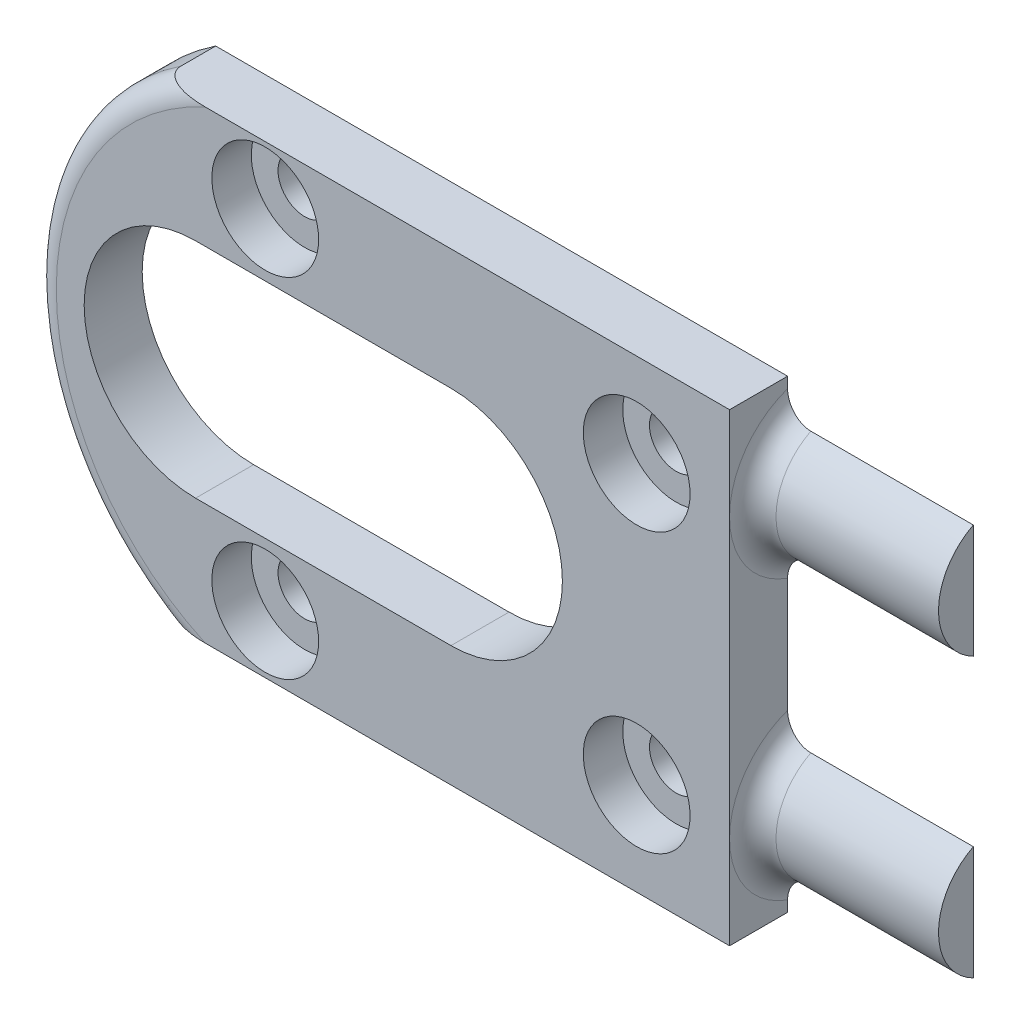
ISO-10303-21;
HEADER;
FILE_DESCRIPTION(('STEP AP214'),'2;1');
FILE_NAME('part.step','',(''),(''),'','','');
FILE_SCHEMA(('AUTOMOTIVE_DESIGN { 1 0 10303 214 1 1 1 1 }'));
ENDSEC;
DATA;
#1=APPLICATION_CONTEXT('core data for automotive mechanical design processes');
#2=APPLICATION_PROTOCOL_DEFINITION('international standard','automotive_design',2000,#1);
#3=PRODUCT_CONTEXT('',#1,'mechanical');
#4=PRODUCT('Part','Part','',(#3));
#5=PRODUCT_RELATED_PRODUCT_CATEGORY('part','',(#4));
#6=PRODUCT_DEFINITION_FORMATION('','',#4);
#7=PRODUCT_DEFINITION_CONTEXT('part definition',#1,'design');
#8=PRODUCT_DEFINITION('design','',#6,#7);
#9=PRODUCT_DEFINITION_SHAPE('','',#8);
#10=(LENGTH_UNIT() NAMED_UNIT(*) SI_UNIT(.MILLI.,.METRE.));
#11=(NAMED_UNIT(*) PLANE_ANGLE_UNIT() SI_UNIT($,.RADIAN.));
#12=(NAMED_UNIT(*) SI_UNIT($,.STERADIAN.) SOLID_ANGLE_UNIT());
#13=UNCERTAINTY_MEASURE_WITH_UNIT(LENGTH_MEASURE(1.E-05),#10,'distance_accuracy_value','');
#14=(GEOMETRIC_REPRESENTATION_CONTEXT(3) GLOBAL_UNCERTAINTY_ASSIGNED_CONTEXT((#13)) GLOBAL_UNIT_ASSIGNED_CONTEXT((#10,
#11,#12)) REPRESENTATION_CONTEXT('',''));
#15=CARTESIAN_POINT('',(0.,0.,0.));
#16=DIRECTION('',(0.,0.,1.));
#17=DIRECTION('',(1.,0.,0.));
#18=AXIS2_PLACEMENT_3D('',#15,#16,#17);
#19=CARTESIAN_POINT('',(15.,-10.,2.5));
#20=DIRECTION('',(-1.,0.,0.));
#21=DIRECTION('',(0.,0.,1.));
#22=AXIS2_PLACEMENT_3D('',#19,#20,#21);
#23=PLANE('',#22);
#24=DIRECTION('',(0.,1.,0.));
#25=VECTOR('',#24,1.);
#26=CARTESIAN_POINT('',(15.,-10.,0.));
#27=LINE('',#26,#25);
#28=CARTESIAN_POINT('',(15.,-2.46446609406726,0.));
#29=VERTEX_POINT('',#28);
#30=CARTESIAN_POINT('',(15.,2.46446609406726,0.));
#31=VERTEX_POINT('',#30);
#32=EDGE_CURVE('E232',#29,#31,#27,.T.);
#33=ORIENTED_EDGE('',*,*,#32,.T.);
#34=CARTESIAN_POINT('',(15.,6.,-1.25));
#35=DIRECTION('',(-1.,0.,0.));
#36=DIRECTION('',(0.,0.,1.));
#37=AXIS2_PLACEMENT_3D('',#34,#35,#36);
#38=CIRCLE('',#37,3.75);
#39=CARTESIAN_POINT('',(15.,6.,2.5));
#40=VERTEX_POINT('',#39);
#41=EDGE_CURVE('E258',#31,#40,#38,.T.);
#42=ORIENTED_EDGE('',*,*,#41,.T.);
#43=DIRECTION('',(0.,1.,0.));
#44=VECTOR('',#43,1.);
#45=CARTESIAN_POINT('',(15.,-10.,2.5));
#46=LINE('',#45,#44);
#47=CARTESIAN_POINT('',(15.,-6.,2.5));
#48=VERTEX_POINT('',#47);
#49=EDGE_CURVE('E221',#48,#40,#46,.T.);
#50=ORIENTED_EDGE('',*,*,#49,.F.);
#51=CARTESIAN_POINT('',(15.,-6.,-1.25));
#52=DIRECTION('',(-1.,0.,0.));
#53=DIRECTION('',(0.,0.,1.));
#54=AXIS2_PLACEMENT_3D('',#51,#52,#53);
#55=CIRCLE('',#54,3.75);
#56=EDGE_CURVE('E252',#48,#29,#55,.T.);
#57=ORIENTED_EDGE('',*,*,#56,.T.);
#58=EDGE_LOOP('',(#33,#42,#50,#57));
#59=FACE_BOUND('',#58,.T.);
#60=ADVANCED_FACE('F34',(#59),#23,.F.);
#61=CARTESIAN_POINT('',(15.,-10.,0.));
#62=VERTEX_POINT('',#61);
#63=CARTESIAN_POINT('',(15.,-9.53553390593274,0.));
#64=VERTEX_POINT('',#63);
#65=EDGE_CURVE('E228',#62,#64,#27,.T.);
#66=ORIENTED_EDGE('',*,*,#65,.T.);
#67=CARTESIAN_POINT('',(15.,-6.,-1.25));
#68=DIRECTION('',(-1.,0.,0.));
#69=DIRECTION('',(0.,0.,1.));
#70=AXIS2_PLACEMENT_3D('',#67,#68,#69);
#71=CIRCLE('',#70,3.75);
#72=EDGE_CURVE('E254',#64,#48,#71,.T.);
#73=ORIENTED_EDGE('',*,*,#72,.T.);
#74=CARTESIAN_POINT('',(15.,-10.,2.5));
#75=VERTEX_POINT('',#74);
#76=EDGE_CURVE('E217',#75,#48,#46,.T.);
#77=ORIENTED_EDGE('',*,*,#76,.F.);
#78=DIRECTION('',(0.,0.,-1.));
#79=VECTOR('',#78,1.);
#80=CARTESIAN_POINT('',(15.,-10.,2.5));
#81=LINE('',#80,#79);
#82=EDGE_CURVE('E227',#75,#62,#81,.T.);
#83=ORIENTED_EDGE('',*,*,#82,.T.);
#84=EDGE_LOOP('',(#66,#73,#77,#83));
#85=FACE_BOUND('',#84,.T.);
#86=ADVANCED_FACE('F319',(#85),#23,.F.);
#87=CARTESIAN_POINT('',(15.,10.,2.5));
#88=VERTEX_POINT('',#87);
#89=EDGE_CURVE('E222',#40,#88,#46,.T.);
#90=ORIENTED_EDGE('',*,*,#89,.F.);
#91=CARTESIAN_POINT('',(15.,6.,-1.25));
#92=DIRECTION('',(-1.,0.,0.));
#93=DIRECTION('',(0.,0.,1.));
#94=AXIS2_PLACEMENT_3D('',#91,#92,#93);
#95=CIRCLE('',#94,3.75);
#96=CARTESIAN_POINT('',(15.,9.53553390593274,0.));
#97=VERTEX_POINT('',#96);
#98=EDGE_CURVE('E256',#40,#97,#95,.T.);
#99=ORIENTED_EDGE('',*,*,#98,.T.);
#100=CARTESIAN_POINT('',(15.,10.,0.));
#101=VERTEX_POINT('',#100);
#102=EDGE_CURVE('E216',#97,#101,#27,.T.);
#103=ORIENTED_EDGE('',*,*,#102,.T.);
#104=DIRECTION('',(0.,0.,-1.));
#105=VECTOR('',#104,1.);
#106=CARTESIAN_POINT('',(15.,10.,2.5));
#107=LINE('',#106,#105);
#108=EDGE_CURVE('E246',#88,#101,#107,.T.);
#109=ORIENTED_EDGE('',*,*,#108,.F.);
#110=EDGE_LOOP('',(#90,#99,#103,#109));
#111=FACE_BOUND('',#110,.T.);
#112=ADVANCED_FACE('F321',(#111),#23,.F.);
#113=CARTESIAN_POINT('',(15.,10.,2.5));
#114=DIRECTION('',(0.,-1.,0.));
#115=DIRECTION('',(0.,0.,-1.));
#116=AXIS2_PLACEMENT_3D('',#113,#114,#115);
#117=PLANE('',#116);
#118=DIRECTION('',(0.,0.,-1.));
#119=VECTOR('',#118,1.);
#120=CARTESIAN_POINT('',(-9.6332495807108,10.,2.5));
#121=LINE('',#120,#119);
#122=CARTESIAN_POINT('',(-9.6332495807108,10.,1.5));
#123=VERTEX_POINT('',#122);
#124=CARTESIAN_POINT('',(-9.6332495807108,10.,0.));
#125=VERTEX_POINT('',#124);
#126=EDGE_CURVE('E244',#123,#125,#121,.T.);
#127=ORIENTED_EDGE('',*,*,#126,.F.);
#128=CARTESIAN_POINT('',(-9.6332495807108,10.,1.5));
#129=CARTESIAN_POINT('',(-9.63325639971954,10.,1.51954510592595));
#130=CARTESIAN_POINT('',(-9.63221194825764,10.,1.53907476119535));
#131=CARTESIAN_POINT('',(-9.62809335238027,10.,1.57789193424015));
#132=CARTESIAN_POINT('',(-9.62502206718861,10.,1.59717975416807));
#133=CARTESIAN_POINT('',(-9.61298437011207,10.,1.65391936406916));
#134=CARTESIAN_POINT('',(-9.60118962271173,10.,1.69079700629704));
#135=CARTESIAN_POINT('',(-9.57130716185599,10.,1.76158317660842));
#136=CARTESIAN_POINT('',(-9.55325263359245,10.,1.79550620445922));
#137=CARTESIAN_POINT('',(-9.51215006270882,10.,1.86028616570347));
#138=CARTESIAN_POINT('',(-9.48908452007075,10.,1.89113178655636));
#139=CARTESIAN_POINT('',(-9.42514252616316,10.,1.96606714160381));
#140=CARTESIAN_POINT('',(-9.38155311062992,10.,2.00782695554724));
#141=CARTESIAN_POINT('',(-9.28857219436247,10.,2.08419107862147));
#142=CARTESIAN_POINT('',(-9.23916999992083,10.,2.11878186580884));
#143=CARTESIAN_POINT('',(-9.1434038771087,10.,2.17764542431777));
#144=CARTESIAN_POINT('',(-9.09749761208398,10.,2.2026772167823));
#145=CARTESIAN_POINT('',(-9.00369260015971,10.,2.24871518651012));
#146=CARTESIAN_POINT('',(-8.95579232438649,10.,2.26971820292006));
#147=CARTESIAN_POINT('',(-8.80954290181428,10.,2.32766201903829));
#148=CARTESIAN_POINT('',(-8.70908197643146,10.,2.35928709620501));
#149=CARTESIAN_POINT('',(-8.52284097338611,10.,2.40709000028991));
#150=CARTESIAN_POINT('',(-8.43746874240701,10.,2.42497996010652));
#151=CARTESIAN_POINT('',(-8.26555472462409,10.,2.4544932933987));
#152=CARTESIAN_POINT('',(-8.17901173634607,10.,2.46610963447681));
#153=CARTESIAN_POINT('',(-8.00746557544746,10.,2.48382561877007));
#154=CARTESIAN_POINT('',(-7.92247455061853,10.,2.49004954317488));
#155=CARTESIAN_POINT('',(-7.75250279299976,10.,2.49811856095696));
#156=CARTESIAN_POINT('',(-7.66752261983414,10.,2.49997511584017));
#157=CARTESIAN_POINT('',(-7.58257569495583,10.,2.5));
#158=B_SPLINE_CURVE_WITH_KNOTS('',3,(#128,#129,#130,#131,#132,#133,#134,#135,#136,#137,#138,
#139,#140,#141,#142,#143,#144,#145,#146,#147,#148,#149,#150,#151,#152,#153,#154,#155,#156,#157),
.UNSPECIFIED.,.F.,.F.,(4,2,2,2,2,2,2,2,2,2,2,2,2,2,4),(0.,0.0585790155450753,0.117075570697085,
0.232451053371561,0.347224014907423,0.46240443400231,0.642480982855371,0.822894154654837,
0.979530145511997,1.13628852994282,1.45130010344813,1.71275534182008,1.97450305268128,
2.23004416800392,2.48491390220616),.UNSPECIFIED.);
#159=CARTESIAN_POINT('',(-7.58257569495583,10.,2.5));
#160=VERTEX_POINT('',#159);
#161=EDGE_CURVE('E11',#123,#160,#158,.T.);
#162=ORIENTED_EDGE('',*,*,#161,.T.);
#163=DIRECTION('',(-1.,0.,0.));
#164=VECTOR('',#163,1.);
#165=CARTESIAN_POINT('',(15.,10.,2.5));
#166=LINE('',#165,#164);
#167=EDGE_CURVE('E220',#88,#160,#166,.T.);
#168=ORIENTED_EDGE('',*,*,#167,.F.);
#169=ORIENTED_EDGE('',*,*,#108,.T.);
#170=DIRECTION('',(-1.,0.,0.));
#171=VECTOR('',#170,1.);
#172=CARTESIAN_POINT('',(15.,10.,0.));
#173=LINE('',#172,#171);
#174=EDGE_CURVE('E231',#101,#125,#173,.T.);
#175=ORIENTED_EDGE('',*,*,#174,.T.);
#176=EDGE_LOOP('',(#127,#162,#168,#169,#175));
#177=FACE_BOUND('',#176,.T.);
#178=ADVANCED_FACE('F328',(#177),#117,.F.);
#179=CARTESIAN_POINT('',(-3.,0.,2.5));
#180=DIRECTION('',(0.,0.,-1.));
#181=DIRECTION('',(-1.,0.,0.));
#182=AXIS2_PLACEMENT_3D('',#179,#180,#181);
#183=CYLINDRICAL_SURFACE('',#182,12.);
#184=DIRECTION('',(0.,0.,-1.));
#185=VECTOR('',#184,1.);
#186=CARTESIAN_POINT('',(-9.6332495807108,-10.,2.5));
#187=LINE('',#186,#185);
#188=CARTESIAN_POINT('',(-9.6332495807108,-10.,1.5));
#189=VERTEX_POINT('',#188);
#190=CARTESIAN_POINT('',(-9.6332495807108,-10.,0.));
#191=VERTEX_POINT('',#190);
#192=EDGE_CURVE('E242',#189,#191,#187,.T.);
#193=ORIENTED_EDGE('',*,*,#192,.F.);
#194=CARTESIAN_POINT('',(-3.,0.,1.5));
#195=DIRECTION('',(0.,0.,-1.));
#196=DIRECTION('',(-1.,0.,0.));
#197=AXIS2_PLACEMENT_3D('',#194,#195,#196);
#198=CIRCLE('',#197,12.);
#199=EDGE_CURVE('E47',#189,#123,#198,.T.);
#200=ORIENTED_EDGE('',*,*,#199,.T.);
#201=ORIENTED_EDGE('',*,*,#126,.T.);
#202=CARTESIAN_POINT('',(-3.,0.,0.));
#203=DIRECTION('',(0.,0.,1.));
#204=DIRECTION('',(-1.,0.,0.));
#205=AXIS2_PLACEMENT_3D('',#202,#203,#204);
#206=CIRCLE('',#205,12.);
#207=EDGE_CURVE('E235',#125,#191,#206,.T.);
#208=ORIENTED_EDGE('',*,*,#207,.T.);
#209=EDGE_LOOP('',(#193,#200,#201,#208));
#210=FACE_BOUND('',#209,.T.);
#211=ADVANCED_FACE('F333',(#210),#183,.T.);
#212=CARTESIAN_POINT('',(15.,-10.,2.5));
#213=DIRECTION('',(0.,1.,0.));
#214=DIRECTION('',(-1.,0.,0.));
#215=AXIS2_PLACEMENT_3D('',#212,#213,#214);
#216=PLANE('',#215);
#217=DIRECTION('',(1.,0.,0.));
#218=VECTOR('',#217,1.);
#219=CARTESIAN_POINT('',(15.,-10.,2.5));
#220=LINE('',#219,#218);
#221=CARTESIAN_POINT('',(-7.58257569495584,-10.,2.5));
#222=VERTEX_POINT('',#221);
#223=EDGE_CURVE('E225',#222,#75,#220,.T.);
#224=ORIENTED_EDGE('',*,*,#223,.F.);
#225=CARTESIAN_POINT('',(-7.58257569495584,-10.,2.5));
#226=CARTESIAN_POINT('',(-7.63104262649101,-10.,2.49999835517567));
#227=CARTESIAN_POINT('',(-7.67950833611421,-10.,2.49938868118426));
#228=CARTESIAN_POINT('',(-7.77641575679157,-10.,2.49684305180573));
#229=CARTESIAN_POINT('',(-7.82485745957457,-10.,2.49490678605424));
#230=CARTESIAN_POINT('',(-7.97052156640007,-10.,2.48691887312509));
#231=CARTESIAN_POINT('',(-8.06764031735475,-10.,2.47868605684356));
#232=CARTESIAN_POINT('',(-8.26204470054263,-10.,2.45518268786261));
#233=CARTESIAN_POINT('',(-8.35932199917607,-10.,2.43984146649397));
#234=CARTESIAN_POINT('',(-8.55200244235624,-10.,2.40059025492891));
#235=CARTESIAN_POINT('',(-8.6474091797284,-10.,2.37669883599784));
#236=CARTESIAN_POINT('',(-8.80237563799696,-10.,2.32835906319936));
#237=CARTESIAN_POINT('',(-8.86288824492096,-10.,2.30697969097598));
#238=CARTESIAN_POINT('',(-8.98175241898533,-10.,2.25885011003516));
#239=CARTESIAN_POINT('',(-9.04010495494111,-10.,2.23210234453446));
#240=CARTESIAN_POINT('',(-9.153982539912,-10.,2.1719970087116));
#241=CARTESIAN_POINT('',(-9.20947980926705,-10.,2.13858594673389));
#242=CARTESIAN_POINT('',(-9.3151132791704,-10.,2.06408094985558));
#243=CARTESIAN_POINT('',(-9.36525972274662,-10.,2.02300212356038));
#244=CARTESIAN_POINT('',(-9.43967123860733,-10.,1.94910042193574));
#245=CARTESIAN_POINT('',(-9.46658874617434,-10.,1.91896064978664));
#246=CARTESIAN_POINT('',(-9.51581959939141,-10.,1.85508993750927));
#247=CARTESIAN_POINT('',(-9.5381369423943,-10.,1.821362154189));
#248=CARTESIAN_POINT('',(-9.57383852039298,-10.,1.75576088683151));
#249=CARTESIAN_POINT('',(-9.58805356450731,-10.,1.72434329698205));
#250=CARTESIAN_POINT('',(-9.61103306450232,-10.,1.65959377085482));
#251=CARTESIAN_POINT('',(-9.61981025999958,-10.,1.62626651033265));
#252=CARTESIAN_POINT('',(-9.62806662817604,-10.,1.5771850178016));
#253=CARTESIAN_POINT('',(-9.63000514440199,-10.,1.56181758066485));
#254=CARTESIAN_POINT('',(-9.63259774136711,-10.,1.53096967660741));
#255=CARTESIAN_POINT('',(-9.63325138171649,-10.,1.51548917275733));
#256=CARTESIAN_POINT('',(-9.63324958071234,-10.,1.50000000000026));
#257=B_SPLINE_CURVE_WITH_KNOTS('',3,(#225,#226,#227,#228,#229,#230,#231,#232,#233,#234,#235,
#236,#237,#238,#239,#240,#241,#242,#243,#244,#245,#246,#247,#248,#249,#250,#251,#252,#253,#254,
#255,#256),.UNSPECIFIED.,.F.,.F.,(4,2,2,2,2,2,2,2,2,2,2,2,2,2,2,4),(0.,0.145392888943125,
0.290819805073438,0.582999710503893,0.878148806129895,1.17266068225126,1.36499440993074,
1.55724080202928,1.75109758979115,1.94457635786799,2.06548021854152,2.18627857168897,
2.28932477471368,2.39212864236681,2.43854989688504,2.48498705946464),.UNSPECIFIED.);
#258=EDGE_CURVE('E61',#222,#189,#257,.T.);
#259=ORIENTED_EDGE('',*,*,#258,.T.);
#260=ORIENTED_EDGE('',*,*,#192,.T.);
#261=DIRECTION('',(1.,0.,0.));
#262=VECTOR('',#261,1.);
#263=CARTESIAN_POINT('',(15.,-10.,0.));
#264=LINE('',#263,#262);
#265=EDGE_CURVE('E238',#191,#62,#264,.T.);
#266=ORIENTED_EDGE('',*,*,#265,.T.);
#267=ORIENTED_EDGE('',*,*,#82,.F.);
#268=EDGE_LOOP('',(#224,#259,#260,#266,#267));
#269=FACE_BOUND('',#268,.T.);
#270=ADVANCED_FACE('F286',(#269),#216,.F.);
#271=CARTESIAN_POINT('',(-3.,0.,2.5));
#272=DIRECTION('',(0.,0.,-1.));
#273=DIRECTION('',(-1.,0.,0.));
#274=AXIS2_PLACEMENT_3D('',#271,#272,#273);
#275=PLANE('',#274);
#276=CARTESIAN_POINT('',(11.,6.,2.5));
#277=DIRECTION('',(0.,0.,1.));
#278=DIRECTION('',(1.,0.,0.));
#279=AXIS2_PLACEMENT_3D('',#276,#277,#278);
#280=CIRCLE('',#279,2.3);
#281=CARTESIAN_POINT('',(13.3,6.,2.5));
#282=VERTEX_POINT('',#281);
#283=EDGE_CURVE('E389',#282,#282,#280,.T.);
#284=ORIENTED_EDGE('',*,*,#283,.F.);
#285=EDGE_LOOP('',(#284));
#286=FACE_BOUND('',#285,.T.);
#287=CARTESIAN_POINT('',(11.,-6.,2.5));
#288=DIRECTION('',(0.,0.,1.));
#289=DIRECTION('',(1.,0.,0.));
#290=AXIS2_PLACEMENT_3D('',#287,#288,#289);
#291=CIRCLE('',#290,2.3);
#292=CARTESIAN_POINT('',(13.3,-6.,2.5));
#293=VERTEX_POINT('',#292);
#294=EDGE_CURVE('E393',#293,#293,#291,.T.);
#295=ORIENTED_EDGE('',*,*,#294,.F.);
#296=EDGE_LOOP('',(#295));
#297=FACE_BOUND('',#296,.T.);
#298=CARTESIAN_POINT('',(-5.,-7.5,2.5));
#299=DIRECTION('',(0.,0.,1.));
#300=DIRECTION('',(1.,0.,0.));
#301=AXIS2_PLACEMENT_3D('',#298,#299,#300);
#302=CIRCLE('',#301,2.3);
#303=CARTESIAN_POINT('',(-2.7,-7.5,2.5));
#304=VERTEX_POINT('',#303);
#305=EDGE_CURVE('E397',#304,#304,#302,.T.);
#306=ORIENTED_EDGE('',*,*,#305,.F.);
#307=EDGE_LOOP('',(#306));
#308=FACE_BOUND('',#307,.T.);
#309=CARTESIAN_POINT('',(-5.,7.5,2.5));
#310=DIRECTION('',(0.,0.,1.));
#311=DIRECTION('',(1.,0.,0.));
#312=AXIS2_PLACEMENT_3D('',#309,#310,#311);
#313=CIRCLE('',#312,2.3);
#314=CARTESIAN_POINT('',(-2.7,7.5,2.5));
#315=VERTEX_POINT('',#314);
#316=EDGE_CURVE('E401',#315,#315,#313,.T.);
#317=ORIENTED_EDGE('',*,*,#316,.F.);
#318=EDGE_LOOP('',(#317));
#319=FACE_BOUND('',#318,.T.);
#320=DIRECTION('',(-1.,0.,0.));
#321=VECTOR('',#320,1.);
#322=CARTESIAN_POINT('',(-3.,-4.8,2.5));
#323=LINE('',#322,#321);
#324=CARTESIAN_POINT('',(3.,-4.8,2.5));
#325=VERTEX_POINT('',#324);
#326=CARTESIAN_POINT('',(-8.,-4.8,2.5));
#327=VERTEX_POINT('',#326);
#328=EDGE_CURVE('E188',#325,#327,#323,.T.);
#329=ORIENTED_EDGE('',*,*,#328,.T.);
#330=CARTESIAN_POINT('',(-8.,0.,2.5));
#331=DIRECTION('',(0.,0.,-1.));
#332=DIRECTION('',(-1.,0.,0.));
#333=AXIS2_PLACEMENT_3D('',#330,#331,#332);
#334=CIRCLE('',#333,4.8);
#335=CARTESIAN_POINT('',(-8.,4.8,2.5));
#336=VERTEX_POINT('',#335);
#337=EDGE_CURVE('E191',#327,#336,#334,.T.);
#338=ORIENTED_EDGE('',*,*,#337,.T.);
#339=DIRECTION('',(1.,0.,0.));
#340=VECTOR('',#339,1.);
#341=CARTESIAN_POINT('',(-3.,4.8,2.5));
#342=LINE('',#341,#340);
#343=CARTESIAN_POINT('',(3.,4.8,2.5));
#344=VERTEX_POINT('',#343);
#345=EDGE_CURVE('E183',#336,#344,#342,.T.);
#346=ORIENTED_EDGE('',*,*,#345,.T.);
#347=CARTESIAN_POINT('',(3.,0.,2.5));
#348=DIRECTION('',(0.,0.,-1.));
#349=DIRECTION('',(-1.,0.,0.));
#350=AXIS2_PLACEMENT_3D('',#347,#348,#349);
#351=CIRCLE('',#350,4.8);
#352=EDGE_CURVE('E158',#344,#325,#351,.T.);
#353=ORIENTED_EDGE('',*,*,#352,.T.);
#354=EDGE_LOOP('',(#329,#338,#346,#353));
#355=FACE_BOUND('',#354,.T.);
#356=ORIENTED_EDGE('',*,*,#167,.T.);
#357=CARTESIAN_POINT('',(-3.,0.,2.5));
#358=DIRECTION('',(0.,0.,-1.));
#359=DIRECTION('',(-1.,0.,0.));
#360=AXIS2_PLACEMENT_3D('',#357,#358,#359);
#361=CIRCLE('',#360,11.);
#362=EDGE_CURVE('E362',#160,#222,#361,.F.);
#363=ORIENTED_EDGE('',*,*,#362,.T.);
#364=ORIENTED_EDGE('',*,*,#223,.T.);
#365=ORIENTED_EDGE('',*,*,#76,.T.);
#366=ORIENTED_EDGE('',*,*,#49,.T.);
#367=ORIENTED_EDGE('',*,*,#89,.T.);
#368=EDGE_LOOP('',(#356,#363,#364,#365,#366,#367));
#369=FACE_BOUND('',#368,.T.);
#370=ADVANCED_FACE('F283',(#286,#297,#308,#319,#355,#369),#275,.F.);
#371=CARTESIAN_POINT('',(-3.,0.,0.));
#372=DIRECTION('',(0.,0.,-1.));
#373=DIRECTION('',(-1.,0.,0.));
#374=AXIS2_PLACEMENT_3D('',#371,#372,#373);
#375=PLANE('',#374);
#376=CARTESIAN_POINT('',(11.,6.,0.));
#377=DIRECTION('',(0.,0.,1.));
#378=DIRECTION('',(1.,0.,0.));
#379=AXIS2_PLACEMENT_3D('',#376,#377,#378);
#380=CIRCLE('',#379,1.15);
#381=CARTESIAN_POINT('',(12.15,6.,0.));
#382=VERTEX_POINT('',#381);
#383=EDGE_CURVE('E425',#382,#382,#380,.T.);
#384=ORIENTED_EDGE('',*,*,#383,.T.);
#385=EDGE_LOOP('',(#384));
#386=FACE_BOUND('',#385,.T.);
#387=CARTESIAN_POINT('',(11.,-6.,0.));
#388=DIRECTION('',(0.,0.,1.));
#389=DIRECTION('',(1.,0.,0.));
#390=AXIS2_PLACEMENT_3D('',#387,#388,#389);
#391=CIRCLE('',#390,1.15);
#392=CARTESIAN_POINT('',(12.15,-6.,0.));
#393=VERTEX_POINT('',#392);
#394=EDGE_CURVE('E437',#393,#393,#391,.T.);
#395=ORIENTED_EDGE('',*,*,#394,.T.);
#396=EDGE_LOOP('',(#395));
#397=FACE_BOUND('',#396,.T.);
#398=CARTESIAN_POINT('',(-5.,-7.5,0.));
#399=DIRECTION('',(0.,0.,1.));
#400=DIRECTION('',(1.,0.,0.));
#401=AXIS2_PLACEMENT_3D('',#398,#399,#400);
#402=CIRCLE('',#401,1.15);
#403=CARTESIAN_POINT('',(-3.85,-7.5,0.));
#404=VERTEX_POINT('',#403);
#405=EDGE_CURVE('E431',#404,#404,#402,.T.);
#406=ORIENTED_EDGE('',*,*,#405,.T.);
#407=EDGE_LOOP('',(#406));
#408=FACE_BOUND('',#407,.T.);
#409=CARTESIAN_POINT('',(-5.,7.5,0.));
#410=DIRECTION('',(0.,0.,1.));
#411=DIRECTION('',(1.,0.,0.));
#412=AXIS2_PLACEMENT_3D('',#409,#410,#411);
#413=CIRCLE('',#412,1.15);
#414=CARTESIAN_POINT('',(-3.85,7.5,0.));
#415=VERTEX_POINT('',#414);
#416=EDGE_CURVE('E412',#415,#415,#413,.T.);
#417=ORIENTED_EDGE('',*,*,#416,.T.);
#418=EDGE_LOOP('',(#417));
#419=FACE_BOUND('',#418,.T.);
#420=CARTESIAN_POINT('',(-8.,0.,0.));
#421=DIRECTION('',(0.,0.,-1.));
#422=DIRECTION('',(-1.,0.,0.));
#423=AXIS2_PLACEMENT_3D('',#420,#421,#422);
#424=CIRCLE('',#423,4.8);
#425=CARTESIAN_POINT('',(-8.,-4.8,0.));
#426=VERTEX_POINT('',#425);
#427=CARTESIAN_POINT('',(-8.,4.8,0.));
#428=VERTEX_POINT('',#427);
#429=EDGE_CURVE('E171',#426,#428,#424,.T.);
#430=ORIENTED_EDGE('',*,*,#429,.F.);
#431=DIRECTION('',(-1.,0.,0.));
#432=VECTOR('',#431,1.);
#433=CARTESIAN_POINT('',(-8.,-4.8,0.));
#434=LINE('',#433,#432);
#435=CARTESIAN_POINT('',(3.,-4.8,0.));
#436=VERTEX_POINT('',#435);
#437=EDGE_CURVE('E176',#436,#426,#434,.T.);
#438=ORIENTED_EDGE('',*,*,#437,.F.);
#439=CARTESIAN_POINT('',(3.,0.,0.));
#440=DIRECTION('',(0.,0.,-1.));
#441=DIRECTION('',(-1.,0.,0.));
#442=AXIS2_PLACEMENT_3D('',#439,#440,#441);
#443=CIRCLE('',#442,4.8);
#444=CARTESIAN_POINT('',(3.,4.8,0.));
#445=VERTEX_POINT('',#444);
#446=EDGE_CURVE('E155',#445,#436,#443,.T.);
#447=ORIENTED_EDGE('',*,*,#446,.F.);
#448=DIRECTION('',(1.,0.,0.));
#449=VECTOR('',#448,1.);
#450=CARTESIAN_POINT('',(-8.,4.8,0.));
#451=LINE('',#450,#449);
#452=EDGE_CURVE('E166',#428,#445,#451,.T.);
#453=ORIENTED_EDGE('',*,*,#452,.F.);
#454=EDGE_LOOP('',(#430,#438,#447,#453));
#455=FACE_BOUND('',#454,.T.);
#456=ORIENTED_EDGE('',*,*,#65,.F.);
#457=ORIENTED_EDGE('',*,*,#265,.F.);
#458=ORIENTED_EDGE('',*,*,#207,.F.);
#459=ORIENTED_EDGE('',*,*,#174,.F.);
#460=ORIENTED_EDGE('',*,*,#102,.F.);
#461=CARTESIAN_POINT('',(15.,9.53553390593274,0.));
#462=CARTESIAN_POINT('',(14.999968521964,9.47146518761681,0.));
#463=CARTESIAN_POINT('',(15.005471264306,9.40742697398487,0.));
#464=CARTESIAN_POINT('',(15.0270964858617,9.28117035792129,0.));
#465=CARTESIAN_POINT('',(15.0432181470077,9.21895181569014,0.));
#466=CARTESIAN_POINT('',(15.0856362640751,9.09807259308852,0.));
#467=CARTESIAN_POINT('',(15.1119344604443,9.03941252329403,0.));
#468=CARTESIAN_POINT('',(15.1740743716742,8.92737234993082,0.));
#469=CARTESIAN_POINT('',(15.2099156595761,8.87399201029305,0.));
#470=CARTESIAN_POINT('',(15.2900115072575,8.77471441454921,0.));
#471=CARTESIAN_POINT('',(15.3341894391157,8.72875557454687,0.));
#472=CARTESIAN_POINT('',(15.4301776750471,8.64558538732163,0.));
#473=CARTESIAN_POINT('',(15.4819866798353,8.60837255377652,0.));
#474=CARTESIAN_POINT('',(15.5878456299673,8.54688952853606,0.));
#475=CARTESIAN_POINT('',(15.6414658951407,8.52188056986894,0.));
#476=CARTESIAN_POINT('',(15.7524171339187,8.48246386310755,0.));
#477=CARTESIAN_POINT('',(15.8097388206692,8.46803062524083,0.));
#478=CARTESIAN_POINT('',(15.8897168180624,8.45605863108256,0.));
#479=CARTESIAN_POINT('',(15.9117138995989,8.45359679522019,0.));
#480=CARTESIAN_POINT('',(15.9558031076005,8.45031385341329,0.));
#481=CARTESIAN_POINT('',(15.9778950851372,8.4494907468797,0.));
#482=CARTESIAN_POINT('',(16.,8.44948974278342,0.));
#483=B_SPLINE_CURVE_WITH_KNOTS('',3,(#461,#462,#463,#464,#465,#466,#467,#468,#469,#470,#471,
#472,#473,#474,#475,#476,#477,#478,#479,#480,#481,#482),.UNSPECIFIED.,.F.,.F.,(4,2,2,2,2,2,2,2,
2,2,4),(0.,0.191929740094645,0.383844695902327,0.575792488592646,0.767731694965678,
0.957985750529475,1.14820745033942,1.32473800070923,1.50084166204361,1.5671965847178,
1.6334704503616),.UNSPECIFIED.);
#484=CARTESIAN_POINT('',(16.,8.44948974278318,0.));
#485=VERTEX_POINT('',#484);
#486=EDGE_CURVE('E270',#97,#485,#483,.T.);
#487=ORIENTED_EDGE('',*,*,#486,.T.);
#488=DIRECTION('',(-1.,0.,0.));
#489=VECTOR('',#488,1.);
#490=CARTESIAN_POINT('',(23.,8.44948974278318,0.));
#491=LINE('',#490,#489);
#492=CARTESIAN_POINT('',(23.,8.44948974278318,0.));
#493=VERTEX_POINT('',#492);
#494=EDGE_CURVE('E199',#493,#485,#491,.T.);
#495=ORIENTED_EDGE('',*,*,#494,.F.);
#496=DIRECTION('',(0.,1.,0.));
#497=VECTOR('',#496,1.);
#498=CARTESIAN_POINT('',(23.,3.55051025721682,0.));
#499=LINE('',#498,#497);
#500=CARTESIAN_POINT('',(23.,3.55051025721682,0.));
#501=VERTEX_POINT('',#500);
#502=EDGE_CURVE('E197',#501,#493,#499,.T.);
#503=ORIENTED_EDGE('',*,*,#502,.F.);
#504=DIRECTION('',(-1.,0.,0.));
#505=VECTOR('',#504,1.);
#506=CARTESIAN_POINT('',(23.,3.55051025721682,0.));
#507=LINE('',#506,#505);
#508=CARTESIAN_POINT('',(16.,3.55051025721682,0.));
#509=VERTEX_POINT('',#508);
#510=EDGE_CURVE('E202',#501,#509,#507,.T.);
#511=ORIENTED_EDGE('',*,*,#510,.T.);
#512=CARTESIAN_POINT('',(16.,3.55051025721682,0.));
#513=CARTESIAN_POINT('',(15.9738397525098,3.55051235313432,0.));
#514=CARTESIAN_POINT('',(15.9476932490628,3.54935691838318,0.));
#515=CARTESIAN_POINT('',(15.8956107654842,3.54476250585941,0.));
#516=CARTESIAN_POINT('',(15.869674714013,3.54132433768769,0.));
#517=CARTESIAN_POINT('',(15.7926869036697,3.52767750022128,0.));
#518=CARTESIAN_POINT('',(15.7421897966479,3.51413578242257,0.));
#519=CARTESIAN_POINT('',(15.6442535801763,3.47885729042756,0.));
#520=CARTESIAN_POINT('',(15.5968115579477,3.45712846160764,0.));
#521=CARTESIAN_POINT('',(15.5059498531064,3.40640639882439,0.));
#522=CARTESIAN_POINT('',(15.4625337893982,3.37740671421223,0.));
#523=CARTESIAN_POINT('',(15.3784010502307,3.31146628649849,0.));
#524=CARTESIAN_POINT('',(15.3379532117856,3.27418360094178,0.));
#525=CARTESIAN_POINT('',(15.2631985158709,3.19390731776321,0.));
#526=CARTESIAN_POINT('',(15.2288936892697,3.15091183965585,0.));
#527=CARTESIAN_POINT('',(15.1639356942959,3.05588686841911,0.));
#528=CARTESIAN_POINT('',(15.1339730161233,3.00338478948239,0.));
#529=CARTESIAN_POINT('',(15.0827229869129,2.89430554311444,0.));
#530=CARTESIAN_POINT('',(15.0614364493976,2.83772799412986,0.));
#531=CARTESIAN_POINT('',(15.0299556245982,2.72864202629326,0.));
#532=CARTESIAN_POINT('',(15.0187635949291,2.67641919150604,0.));
#533=CARTESIAN_POINT('',(15.0037814321663,2.57096029672319,0.));
#534=CARTESIAN_POINT('',(14.9999863243796,2.51772494202991,0.));
#535=CARTESIAN_POINT('',(15.,2.46446609406726,0.));
#536=B_SPLINE_CURVE_WITH_KNOTS('',3,(#512,#513,#514,#515,#516,#517,#518,#519,#520,#521,#522,
#523,#524,#525,#526,#527,#528,#529,#530,#531,#532,#533,#534,#535),.UNSPECIFIED.,.F.,.F.,(4,2,2,
2,2,2,2,2,2,2,2,4),(0.,0.0784285688429032,0.156829336828261,0.312844708041727,0.468709058787967,
0.624712183588734,0.789064706029557,0.953471463201908,1.1340401704883,1.31462580499194,
1.47433755675651,1.63394185957592),.UNSPECIFIED.);
#537=EDGE_CURVE('E263',#509,#31,#536,.T.);
#538=ORIENTED_EDGE('',*,*,#537,.T.);
#539=ORIENTED_EDGE('',*,*,#32,.F.);
#540=CARTESIAN_POINT('',(15.,-2.46446609406726,0.));
#541=CARTESIAN_POINT('',(14.999968521964,-2.52853481238319,0.));
#542=CARTESIAN_POINT('',(15.005471264306,-2.59257302601514,0.));
#543=CARTESIAN_POINT('',(15.0270964858617,-2.71882964207872,0.));
#544=CARTESIAN_POINT('',(15.0432181470077,-2.78104818430986,0.));
#545=CARTESIAN_POINT('',(15.0856362640751,-2.90192740691148,0.));
#546=CARTESIAN_POINT('',(15.1119344604443,-2.96058747670598,0.));
#547=CARTESIAN_POINT('',(15.1740743716742,-3.07262765006919,0.));
#548=CARTESIAN_POINT('',(15.2099156595761,-3.12600798970695,0.));
#549=CARTESIAN_POINT('',(15.2900115072575,-3.22528558545079,0.));
#550=CARTESIAN_POINT('',(15.3341894391157,-3.27124442545313,0.));
#551=CARTESIAN_POINT('',(15.4301776750471,-3.35441461267837,0.));
#552=CARTESIAN_POINT('',(15.4819866798354,-3.39162744622349,0.));
#553=CARTESIAN_POINT('',(15.5878456299673,-3.45311047146394,0.));
#554=CARTESIAN_POINT('',(15.6414658951407,-3.47811943013106,0.));
#555=CARTESIAN_POINT('',(15.7524171339187,-3.51753613689245,0.));
#556=CARTESIAN_POINT('',(15.8097388206692,-3.53196937475917,0.));
#557=CARTESIAN_POINT('',(15.8897168180624,-3.54394136891745,0.));
#558=CARTESIAN_POINT('',(15.9117138995989,-3.54640320477981,0.));
#559=CARTESIAN_POINT('',(15.9558031076005,-3.54968614658671,0.));
#560=CARTESIAN_POINT('',(15.9778950851372,-3.5505092531203,0.));
#561=CARTESIAN_POINT('',(16.,-3.55051025721659,0.));
#562=B_SPLINE_CURVE_WITH_KNOTS('',3,(#540,#541,#542,#543,#544,#545,#546,#547,#548,#549,#550,
#551,#552,#553,#554,#555,#556,#557,#558,#559,#560,#561),.UNSPECIFIED.,.F.,.F.,(4,2,2,2,2,2,2,2,
2,2,4),(0.,0.191929740094646,0.383844695902328,0.575792488592648,0.767731694965678,
0.957985750529476,1.14820745033942,1.32473800070924,1.50084166204361,1.5671965847178,
1.6334704503616),.UNSPECIFIED.);
#563=CARTESIAN_POINT('',(16.,-3.55051025721682,0.));
#564=VERTEX_POINT('',#563);
#565=EDGE_CURVE('E297',#29,#564,#562,.T.);
#566=ORIENTED_EDGE('',*,*,#565,.T.);
#567=DIRECTION('',(-1.,0.,0.));
#568=VECTOR('',#567,1.);
#569=CARTESIAN_POINT('',(23.,-3.55051025721682,0.));
#570=LINE('',#569,#568);
#571=CARTESIAN_POINT('',(23.,-3.55051025721682,0.));
#572=VERTEX_POINT('',#571);
#573=EDGE_CURVE('E210',#572,#564,#570,.T.);
#574=ORIENTED_EDGE('',*,*,#573,.F.);
#575=DIRECTION('',(0.,1.,0.));
#576=VECTOR('',#575,1.);
#577=CARTESIAN_POINT('',(23.,-8.44948974278318,0.));
#578=LINE('',#577,#576);
#579=CARTESIAN_POINT('',(23.,-8.44948974278318,0.));
#580=VERTEX_POINT('',#579);
#581=EDGE_CURVE('E208',#580,#572,#578,.T.);
#582=ORIENTED_EDGE('',*,*,#581,.F.);
#583=DIRECTION('',(-1.,0.,0.));
#584=VECTOR('',#583,1.);
#585=CARTESIAN_POINT('',(23.,-8.44948974278318,0.));
#586=LINE('',#585,#584);
#587=CARTESIAN_POINT('',(16.,-8.44948974278318,0.));
#588=VERTEX_POINT('',#587);
#589=EDGE_CURVE('E213',#580,#588,#586,.T.);
#590=ORIENTED_EDGE('',*,*,#589,.T.);
#591=CARTESIAN_POINT('',(16.,-8.44948974278318,0.));
#592=CARTESIAN_POINT('',(15.9738397525098,-8.44948764686568,0.));
#593=CARTESIAN_POINT('',(15.9476932490628,-8.45064308161682,0.));
#594=CARTESIAN_POINT('',(15.8956107654842,-8.45523749414059,0.));
#595=CARTESIAN_POINT('',(15.869674714013,-8.45867566231231,0.));
#596=CARTESIAN_POINT('',(15.7926869036697,-8.47232249977873,0.));
#597=CARTESIAN_POINT('',(15.7421897966479,-8.48586421757743,0.));
#598=CARTESIAN_POINT('',(15.6442535801763,-8.52114270957245,0.));
#599=CARTESIAN_POINT('',(15.5968115579477,-8.54287153839236,0.));
#600=CARTESIAN_POINT('',(15.5059498531064,-8.59359360117561,0.));
#601=CARTESIAN_POINT('',(15.4625337893982,-8.62259328578778,0.));
#602=CARTESIAN_POINT('',(15.3784010502307,-8.68853371350151,0.));
#603=CARTESIAN_POINT('',(15.3379532117856,-8.72581639905823,0.));
#604=CARTESIAN_POINT('',(15.2631985158709,-8.8060926822368,0.));
#605=CARTESIAN_POINT('',(15.2288936892697,-8.84908816034416,0.));
#606=CARTESIAN_POINT('',(15.1639356942959,-8.9441131315809,0.));
#607=CARTESIAN_POINT('',(15.1339730161233,-8.99661521051762,0.));
#608=CARTESIAN_POINT('',(15.0827229869129,-9.10569445688556,0.));
#609=CARTESIAN_POINT('',(15.0614364493976,-9.16227200587015,0.));
#610=CARTESIAN_POINT('',(15.0299556245982,-9.27135797370674,0.));
#611=CARTESIAN_POINT('',(15.0187635949291,-9.32358080849396,0.));
#612=CARTESIAN_POINT('',(15.0037814321663,-9.42903970327681,0.));
#613=CARTESIAN_POINT('',(14.9999863243796,-9.48227505797009,0.));
#614=CARTESIAN_POINT('',(15.,-9.53553390593274,0.));
#615=B_SPLINE_CURVE_WITH_KNOTS('',3,(#591,#592,#593,#594,#595,#596,#597,#598,#599,#600,#601,
#602,#603,#604,#605,#606,#607,#608,#609,#610,#611,#612,#613,#614),.UNSPECIFIED.,.F.,.F.,(4,2,2,
2,2,2,2,2,2,2,2,4),(0.,0.0784285688429033,0.156829336828261,0.312844708041727,0.468709058787967,
0.624712183588736,0.789064706029562,0.95347146320191,1.1340401704883,1.31462580499194,
1.47433755675651,1.63394185957592),.UNSPECIFIED.);
#616=EDGE_CURVE('E293',#588,#64,#615,.T.);
#617=ORIENTED_EDGE('',*,*,#616,.T.);
#618=EDGE_LOOP('',(#456,#457,#458,#459,#460,#487,#495,#503,#511,#538,#539,#566,#574,#582,#590,#617));
#619=FACE_BOUND('',#618,.T.);
#620=ADVANCED_FACE('F173',(#386,#397,#408,#419,#455,#619),#375,.T.);
#621=CARTESIAN_POINT('',(23.,-6.,-1.25));
#622=DIRECTION('',(-1.,0.,0.));
#623=DIRECTION('',(0.,0.,1.));
#624=AXIS2_PLACEMENT_3D('',#621,#622,#623);
#625=CYLINDRICAL_SURFACE('',#624,2.75);
#626=ORIENTED_EDGE('',*,*,#573,.T.);
#627=CARTESIAN_POINT('',(16.,-6.,-1.25));
#628=DIRECTION('',(-1.,0.,0.));
#629=DIRECTION('',(0.,0.,1.));
#630=AXIS2_PLACEMENT_3D('',#627,#628,#629);
#631=CIRCLE('',#630,2.75);
#632=EDGE_CURVE('E260',#564,#588,#631,.F.);
#633=ORIENTED_EDGE('',*,*,#632,.T.);
#634=ORIENTED_EDGE('',*,*,#589,.F.);
#635=CARTESIAN_POINT('',(23.,-6.,-1.25));
#636=DIRECTION('',(1.,0.,0.));
#637=DIRECTION('',(0.,0.,-1.));
#638=AXIS2_PLACEMENT_3D('',#635,#636,#637);
#639=CIRCLE('',#638,2.75);
#640=EDGE_CURVE('E205',#572,#580,#639,.T.);
#641=ORIENTED_EDGE('',*,*,#640,.F.);
#642=EDGE_LOOP('',(#626,#633,#634,#641));
#643=FACE_BOUND('',#642,.T.);
#644=ADVANCED_FACE('F282',(#643),#625,.T.);
#645=CARTESIAN_POINT('',(23.,-6.,-1.25));
#646=DIRECTION('',(1.,0.,0.));
#647=DIRECTION('',(0.,0.,-1.));
#648=AXIS2_PLACEMENT_3D('',#645,#646,#647);
#649=PLANE('',#648);
#650=ORIENTED_EDGE('',*,*,#640,.T.);
#651=ORIENTED_EDGE('',*,*,#581,.T.);
#652=EDGE_LOOP('',(#650,#651));
#653=FACE_BOUND('',#652,.T.);
#654=ADVANCED_FACE('F503',(#653),#649,.T.);
#655=CARTESIAN_POINT('',(23.,6.,-1.25));
#656=DIRECTION('',(-1.,0.,0.));
#657=DIRECTION('',(0.,0.,1.));
#658=AXIS2_PLACEMENT_3D('',#655,#656,#657);
#659=CYLINDRICAL_SURFACE('',#658,2.75);
#660=ORIENTED_EDGE('',*,*,#494,.T.);
#661=CARTESIAN_POINT('',(16.,6.,-1.25));
#662=DIRECTION('',(-1.,0.,0.));
#663=DIRECTION('',(0.,0.,1.));
#664=AXIS2_PLACEMENT_3D('',#661,#662,#663);
#665=CIRCLE('',#664,2.75);
#666=EDGE_CURVE('E249',#485,#509,#665,.F.);
#667=ORIENTED_EDGE('',*,*,#666,.T.);
#668=ORIENTED_EDGE('',*,*,#510,.F.);
#669=CARTESIAN_POINT('',(23.,6.,-1.25));
#670=DIRECTION('',(1.,0.,0.));
#671=DIRECTION('',(0.,0.,-1.));
#672=AXIS2_PLACEMENT_3D('',#669,#670,#671);
#673=CIRCLE('',#672,2.75);
#674=EDGE_CURVE('E194',#493,#501,#673,.T.);
#675=ORIENTED_EDGE('',*,*,#674,.F.);
#676=EDGE_LOOP('',(#660,#667,#668,#675));
#677=FACE_BOUND('',#676,.T.);
#678=ADVANCED_FACE('F352',(#677),#659,.T.);
#679=CARTESIAN_POINT('',(23.,6.,-1.25));
#680=DIRECTION('',(1.,0.,0.));
#681=DIRECTION('',(0.,0.,-1.));
#682=AXIS2_PLACEMENT_3D('',#679,#680,#681);
#683=PLANE('',#682);
#684=ORIENTED_EDGE('',*,*,#674,.T.);
#685=ORIENTED_EDGE('',*,*,#502,.T.);
#686=EDGE_LOOP('',(#684,#685));
#687=FACE_BOUND('',#686,.T.);
#688=ADVANCED_FACE('F315',(#687),#683,.T.);
#689=CARTESIAN_POINT('',(16.,6.,-1.25));
#690=DIRECTION('',(-1.,0.,0.));
#691=DIRECTION('',(0.,0.,1.));
#692=AXIS2_PLACEMENT_3D('',#689,#690,#691);
#693=TOROIDAL_SURFACE('',#692,3.75,1.);
#694=ORIENTED_EDGE('',*,*,#98,.F.);
#695=ORIENTED_EDGE('',*,*,#41,.F.);
#696=ORIENTED_EDGE('',*,*,#537,.F.);
#697=ORIENTED_EDGE('',*,*,#666,.F.);
#698=ORIENTED_EDGE('',*,*,#486,.F.);
#699=EDGE_LOOP('',(#694,#695,#696,#697,#698));
#700=FACE_BOUND('',#699,.T.);
#701=ADVANCED_FACE('F275',(#700),#693,.F.);
#702=CARTESIAN_POINT('',(16.,-6.,-1.25));
#703=DIRECTION('',(-1.,0.,0.));
#704=DIRECTION('',(0.,0.,1.));
#705=AXIS2_PLACEMENT_3D('',#702,#703,#704);
#706=TOROIDAL_SURFACE('',#705,3.75,1.);
#707=ORIENTED_EDGE('',*,*,#56,.F.);
#708=ORIENTED_EDGE('',*,*,#72,.F.);
#709=ORIENTED_EDGE('',*,*,#616,.F.);
#710=ORIENTED_EDGE('',*,*,#632,.F.);
#711=ORIENTED_EDGE('',*,*,#565,.F.);
#712=EDGE_LOOP('',(#707,#708,#709,#710,#711));
#713=FACE_BOUND('',#712,.T.);
#714=ADVANCED_FACE('F302',(#713),#706,.F.);
#715=CARTESIAN_POINT('',(-8.,0.,8.));
#716=DIRECTION('',(0.,0.,-1.));
#717=DIRECTION('',(-1.,0.,0.));
#718=AXIS2_PLACEMENT_3D('',#715,#716,#717);
#719=CYLINDRICAL_SURFACE('',#718,4.8);
#720=DIRECTION('',(0.,0.,-1.));
#721=VECTOR('',#720,1.);
#722=CARTESIAN_POINT('',(-8.,-4.8,8.));
#723=LINE('',#722,#721);
#724=EDGE_CURVE('E181',#327,#426,#723,.T.);
#725=ORIENTED_EDGE('',*,*,#724,.T.);
#726=ORIENTED_EDGE('',*,*,#429,.T.);
#727=DIRECTION('',(0.,0.,-1.));
#728=VECTOR('',#727,1.);
#729=CARTESIAN_POINT('',(-8.,4.8,8.));
#730=LINE('',#729,#728);
#731=EDGE_CURVE('E162',#336,#428,#730,.T.);
#732=ORIENTED_EDGE('',*,*,#731,.F.);
#733=ORIENTED_EDGE('',*,*,#337,.F.);
#734=EDGE_LOOP('',(#725,#726,#732,#733));
#735=FACE_BOUND('',#734,.T.);
#736=ADVANCED_FACE('F305',(#735),#719,.F.);
#737=CARTESIAN_POINT('',(-8.,-4.8,8.));
#738=DIRECTION('',(0.,-1.,0.));
#739=DIRECTION('',(1.,0.,0.));
#740=AXIS2_PLACEMENT_3D('',#737,#738,#739);
#741=PLANE('',#740);
#742=DIRECTION('',(0.,0.,-1.));
#743=VECTOR('',#742,1.);
#744=CARTESIAN_POINT('',(3.,-4.8,8.));
#745=LINE('',#744,#743);
#746=EDGE_CURVE('E161',#325,#436,#745,.T.);
#747=ORIENTED_EDGE('',*,*,#746,.T.);
#748=ORIENTED_EDGE('',*,*,#437,.T.);
#749=ORIENTED_EDGE('',*,*,#724,.F.);
#750=ORIENTED_EDGE('',*,*,#328,.F.);
#751=EDGE_LOOP('',(#747,#748,#749,#750));
#752=FACE_BOUND('',#751,.T.);
#753=ADVANCED_FACE('F312',(#752),#741,.F.);
#754=CARTESIAN_POINT('',(3.,0.,8.));
#755=DIRECTION('',(0.,0.,-1.));
#756=DIRECTION('',(-1.,0.,0.));
#757=AXIS2_PLACEMENT_3D('',#754,#755,#756);
#758=CYLINDRICAL_SURFACE('',#757,4.8);
#759=DIRECTION('',(0.,0.,-1.));
#760=VECTOR('',#759,1.);
#761=CARTESIAN_POINT('',(3.,4.8,8.));
#762=LINE('',#761,#760);
#763=EDGE_CURVE('E150',#344,#445,#762,.T.);
#764=ORIENTED_EDGE('',*,*,#763,.T.);
#765=ORIENTED_EDGE('',*,*,#446,.T.);
#766=ORIENTED_EDGE('',*,*,#746,.F.);
#767=ORIENTED_EDGE('',*,*,#352,.F.);
#768=EDGE_LOOP('',(#764,#765,#766,#767));
#769=FACE_BOUND('',#768,.T.);
#770=ADVANCED_FACE('F152',(#769),#758,.F.);
#771=CARTESIAN_POINT('',(-8.,4.8,8.));
#772=DIRECTION('',(0.,1.,0.));
#773=DIRECTION('',(-1.,0.,0.));
#774=AXIS2_PLACEMENT_3D('',#771,#772,#773);
#775=PLANE('',#774);
#776=ORIENTED_EDGE('',*,*,#731,.T.);
#777=ORIENTED_EDGE('',*,*,#452,.T.);
#778=ORIENTED_EDGE('',*,*,#763,.F.);
#779=ORIENTED_EDGE('',*,*,#345,.F.);
#780=EDGE_LOOP('',(#776,#777,#778,#779));
#781=FACE_BOUND('',#780,.T.);
#782=ADVANCED_FACE('F167',(#781),#775,.F.);
#783=CARTESIAN_POINT('',(-5.,7.5,0.8));
#784=DIRECTION('',(0.,0.,1.));
#785=DIRECTION('',(1.,0.,0.));
#786=AXIS2_PLACEMENT_3D('',#783,#784,#785);
#787=CYLINDRICAL_SURFACE('',#786,2.3);
#788=CARTESIAN_POINT('',(-5.,7.5,0.8));
#789=DIRECTION('',(0.,0.,1.));
#790=DIRECTION('',(1.,0.,0.));
#791=AXIS2_PLACEMENT_3D('',#788,#789,#790);
#792=CIRCLE('',#791,2.3);
#793=CARTESIAN_POINT('',(-2.7,7.5,0.8));
#794=VERTEX_POINT('',#793);
#795=EDGE_CURVE('E404',#794,#794,#792,.T.);
#796=ORIENTED_EDGE('',*,*,#795,.F.);
#797=EDGE_LOOP('',(#796));
#798=FACE_BOUND('',#797,.T.);
#799=ORIENTED_EDGE('',*,*,#316,.T.);
#800=EDGE_LOOP('',(#799));
#801=FACE_BOUND('',#800,.T.);
#802=ADVANCED_FACE('F488',(#798,#801),#787,.F.);
#803=CARTESIAN_POINT('',(-5.,7.5,0.8));
#804=DIRECTION('',(0.,0.,1.));
#805=DIRECTION('',(1.,0.,0.));
#806=AXIS2_PLACEMENT_3D('',#803,#804,#805);
#807=PLANE('',#806);
#808=CARTESIAN_POINT('',(-5.,7.5,0.8));
#809=DIRECTION('',(0.,0.,1.));
#810=DIRECTION('',(1.,0.,0.));
#811=AXIS2_PLACEMENT_3D('',#808,#809,#810);
#812=CIRCLE('',#811,1.15);
#813=CARTESIAN_POINT('',(-3.85,7.5,0.8));
#814=VERTEX_POINT('',#813);
#815=EDGE_CURVE('E422',#814,#814,#812,.T.);
#816=ORIENTED_EDGE('',*,*,#815,.F.);
#817=EDGE_LOOP('',(#816));
#818=FACE_BOUND('',#817,.T.);
#819=ORIENTED_EDGE('',*,*,#795,.T.);
#820=EDGE_LOOP('',(#819));
#821=FACE_BOUND('',#820,.T.);
#822=ADVANCED_FACE('F484',(#818,#821),#807,.T.);
#823=CARTESIAN_POINT('',(-5.,-7.5,0.8));
#824=DIRECTION('',(0.,0.,1.));
#825=DIRECTION('',(1.,0.,0.));
#826=AXIS2_PLACEMENT_3D('',#823,#824,#825);
#827=CYLINDRICAL_SURFACE('',#826,2.3);
#828=CARTESIAN_POINT('',(-5.,-7.5,0.8));
#829=DIRECTION('',(0.,0.,1.));
#830=DIRECTION('',(1.,0.,0.));
#831=AXIS2_PLACEMENT_3D('',#828,#829,#830);
#832=CIRCLE('',#831,2.3);
#833=CARTESIAN_POINT('',(-2.7,-7.5,0.8));
#834=VERTEX_POINT('',#833);
#835=EDGE_CURVE('E411',#834,#834,#832,.T.);
#836=ORIENTED_EDGE('',*,*,#835,.F.);
#837=EDGE_LOOP('',(#836));
#838=FACE_BOUND('',#837,.T.);
#839=ORIENTED_EDGE('',*,*,#305,.T.);
#840=EDGE_LOOP('',(#839));
#841=FACE_BOUND('',#840,.T.);
#842=ADVANCED_FACE('F480',(#838,#841),#827,.F.);
#843=CARTESIAN_POINT('',(-5.,-7.5,0.8));
#844=DIRECTION('',(0.,0.,1.));
#845=DIRECTION('',(1.,0.,0.));
#846=AXIS2_PLACEMENT_3D('',#843,#844,#845);
#847=PLANE('',#846);
#848=CARTESIAN_POINT('',(-5.,-7.5,0.8));
#849=DIRECTION('',(0.,0.,1.));
#850=DIRECTION('',(1.,0.,0.));
#851=AXIS2_PLACEMENT_3D('',#848,#849,#850);
#852=CIRCLE('',#851,1.15);
#853=CARTESIAN_POINT('',(-3.85,-7.5,0.8));
#854=VERTEX_POINT('',#853);
#855=EDGE_CURVE('E428',#854,#854,#852,.T.);
#856=ORIENTED_EDGE('',*,*,#855,.F.);
#857=EDGE_LOOP('',(#856));
#858=FACE_BOUND('',#857,.T.);
#859=ORIENTED_EDGE('',*,*,#835,.T.);
#860=EDGE_LOOP('',(#859));
#861=FACE_BOUND('',#860,.T.);
#862=ADVANCED_FACE('F476',(#858,#861),#847,.T.);
#863=CARTESIAN_POINT('',(11.,-6.,0.8));
#864=DIRECTION('',(0.,0.,1.));
#865=DIRECTION('',(1.,0.,0.));
#866=AXIS2_PLACEMENT_3D('',#863,#864,#865);
#867=CYLINDRICAL_SURFACE('',#866,2.3);
#868=CARTESIAN_POINT('',(11.,-6.,0.8));
#869=DIRECTION('',(0.,0.,1.));
#870=DIRECTION('',(1.,0.,0.));
#871=AXIS2_PLACEMENT_3D('',#868,#869,#870);
#872=CIRCLE('',#871,2.3);
#873=CARTESIAN_POINT('',(13.3,-6.,0.8));
#874=VERTEX_POINT('',#873);
#875=EDGE_CURVE('E416',#874,#874,#872,.T.);
#876=ORIENTED_EDGE('',*,*,#875,.F.);
#877=EDGE_LOOP('',(#876));
#878=FACE_BOUND('',#877,.T.);
#879=ORIENTED_EDGE('',*,*,#294,.T.);
#880=EDGE_LOOP('',(#879));
#881=FACE_BOUND('',#880,.T.);
#882=ADVANCED_FACE('F469',(#878,#881),#867,.F.);
#883=CARTESIAN_POINT('',(11.,-6.,0.8));
#884=DIRECTION('',(0.,0.,1.));
#885=DIRECTION('',(1.,0.,0.));
#886=AXIS2_PLACEMENT_3D('',#883,#884,#885);
#887=PLANE('',#886);
#888=CARTESIAN_POINT('',(11.,-6.,0.8));
#889=DIRECTION('',(0.,0.,1.));
#890=DIRECTION('',(1.,0.,0.));
#891=AXIS2_PLACEMENT_3D('',#888,#889,#890);
#892=CIRCLE('',#891,1.15);
#893=CARTESIAN_POINT('',(12.15,-6.,0.8));
#894=VERTEX_POINT('',#893);
#895=EDGE_CURVE('E434',#894,#894,#892,.T.);
#896=ORIENTED_EDGE('',*,*,#895,.F.);
#897=EDGE_LOOP('',(#896));
#898=FACE_BOUND('',#897,.T.);
#899=ORIENTED_EDGE('',*,*,#875,.T.);
#900=EDGE_LOOP('',(#899));
#901=FACE_BOUND('',#900,.T.);
#902=ADVANCED_FACE('F464',(#898,#901),#887,.T.);
#903=CARTESIAN_POINT('',(11.,6.,0.8));
#904=DIRECTION('',(0.,0.,1.));
#905=DIRECTION('',(1.,0.,0.));
#906=AXIS2_PLACEMENT_3D('',#903,#904,#905);
#907=CYLINDRICAL_SURFACE('',#906,2.3);
#908=CARTESIAN_POINT('',(11.,6.,0.8));
#909=DIRECTION('',(0.,0.,1.));
#910=DIRECTION('',(1.,0.,0.));
#911=AXIS2_PLACEMENT_3D('',#908,#909,#910);
#912=CIRCLE('',#911,2.3);
#913=CARTESIAN_POINT('',(13.3,6.,0.8));
#914=VERTEX_POINT('',#913);
#915=EDGE_CURVE('E408',#914,#914,#912,.T.);
#916=ORIENTED_EDGE('',*,*,#915,.F.);
#917=EDGE_LOOP('',(#916));
#918=FACE_BOUND('',#917,.T.);
#919=ORIENTED_EDGE('',*,*,#283,.T.);
#920=EDGE_LOOP('',(#919));
#921=FACE_BOUND('',#920,.T.);
#922=ADVANCED_FACE('F458',(#918,#921),#907,.F.);
#923=CARTESIAN_POINT('',(11.,6.,0.8));
#924=DIRECTION('',(0.,0.,1.));
#925=DIRECTION('',(1.,0.,0.));
#926=AXIS2_PLACEMENT_3D('',#923,#924,#925);
#927=PLANE('',#926);
#928=CARTESIAN_POINT('',(11.,6.,0.8));
#929=DIRECTION('',(0.,0.,1.));
#930=DIRECTION('',(1.,0.,0.));
#931=AXIS2_PLACEMENT_3D('',#928,#929,#930);
#932=CIRCLE('',#931,1.15);
#933=CARTESIAN_POINT('',(12.15,6.,0.8));
#934=VERTEX_POINT('',#933);
#935=EDGE_CURVE('E440',#934,#934,#932,.T.);
#936=ORIENTED_EDGE('',*,*,#935,.F.);
#937=EDGE_LOOP('',(#936));
#938=FACE_BOUND('',#937,.T.);
#939=ORIENTED_EDGE('',*,*,#915,.T.);
#940=EDGE_LOOP('',(#939));
#941=FACE_BOUND('',#940,.T.);
#942=ADVANCED_FACE('F455',(#938,#941),#927,.T.);
#943=CARTESIAN_POINT('',(-5.,7.5,0.));
#944=DIRECTION('',(0.,0.,1.));
#945=DIRECTION('',(1.,0.,0.));
#946=AXIS2_PLACEMENT_3D('',#943,#944,#945);
#947=CYLINDRICAL_SURFACE('',#946,1.15);
#948=ORIENTED_EDGE('',*,*,#416,.F.);
#949=EDGE_LOOP('',(#948));
#950=FACE_BOUND('',#949,.T.);
#951=ORIENTED_EDGE('',*,*,#815,.T.);
#952=EDGE_LOOP('',(#951));
#953=FACE_BOUND('',#952,.T.);
#954=ADVANCED_FACE('F451',(#950,#953),#947,.F.);
#955=CARTESIAN_POINT('',(11.,6.,0.));
#956=DIRECTION('',(0.,0.,1.));
#957=DIRECTION('',(1.,0.,0.));
#958=AXIS2_PLACEMENT_3D('',#955,#956,#957);
#959=CYLINDRICAL_SURFACE('',#958,1.15);
#960=ORIENTED_EDGE('',*,*,#383,.F.);
#961=EDGE_LOOP('',(#960));
#962=FACE_BOUND('',#961,.T.);
#963=ORIENTED_EDGE('',*,*,#935,.T.);
#964=EDGE_LOOP('',(#963));
#965=FACE_BOUND('',#964,.T.);
#966=ADVANCED_FACE('F447',(#962,#965),#959,.F.);
#967=CARTESIAN_POINT('',(11.,-6.,0.));
#968=DIRECTION('',(0.,0.,1.));
#969=DIRECTION('',(1.,0.,0.));
#970=AXIS2_PLACEMENT_3D('',#967,#968,#969);
#971=CYLINDRICAL_SURFACE('',#970,1.15);
#972=ORIENTED_EDGE('',*,*,#394,.F.);
#973=EDGE_LOOP('',(#972));
#974=FACE_BOUND('',#973,.T.);
#975=ORIENTED_EDGE('',*,*,#895,.T.);
#976=EDGE_LOOP('',(#975));
#977=FACE_BOUND('',#976,.T.);
#978=ADVANCED_FACE('F450',(#974,#977),#971,.F.);
#979=CARTESIAN_POINT('',(-5.,-7.5,0.));
#980=DIRECTION('',(0.,0.,1.));
#981=DIRECTION('',(1.,0.,0.));
#982=AXIS2_PLACEMENT_3D('',#979,#980,#981);
#983=CYLINDRICAL_SURFACE('',#982,1.15);
#984=ORIENTED_EDGE('',*,*,#405,.F.);
#985=EDGE_LOOP('',(#984));
#986=FACE_BOUND('',#985,.T.);
#987=ORIENTED_EDGE('',*,*,#855,.T.);
#988=EDGE_LOOP('',(#987));
#989=FACE_BOUND('',#988,.T.);
#990=ADVANCED_FACE('F630',(#986,#989),#983,.F.);
#991=CARTESIAN_POINT('',(-3.,0.,1.5));
#992=DIRECTION('',(0.,0.,-1.));
#993=DIRECTION('',(-1.,0.,0.));
#994=AXIS2_PLACEMENT_3D('',#991,#992,#993);
#995=TOROIDAL_SURFACE('',#994,11.,1.);
#996=ORIENTED_EDGE('',*,*,#161,.F.);
#997=ORIENTED_EDGE('',*,*,#199,.F.);
#998=ORIENTED_EDGE('',*,*,#258,.F.);
#999=ORIENTED_EDGE('',*,*,#362,.F.);
#1000=EDGE_LOOP('',(#996,#997,#998,#999));
#1001=FACE_BOUND('',#1000,.T.);
#1002=ADVANCED_FACE('F36',(#1001),#995,.T.);
#1003=CLOSED_SHELL('',(#60,#86,#112,#178,#211,#270,#370,#620,#644,#654,#678,#688,#701,#714,#736,
#753,#770,#782,#802,#822,#842,#862,#882,#902,#922,#942,#954,#966,#978,#990,#1002));
#1004=MANIFOLD_SOLID_BREP('B2',#1003);
#1005=ADVANCED_BREP_SHAPE_REPRESENTATION('',(#18,#1004),#14);
#1006=SHAPE_DEFINITION_REPRESENTATION(#9,#1005);
ENDSEC;
END-ISO-10303-21;
